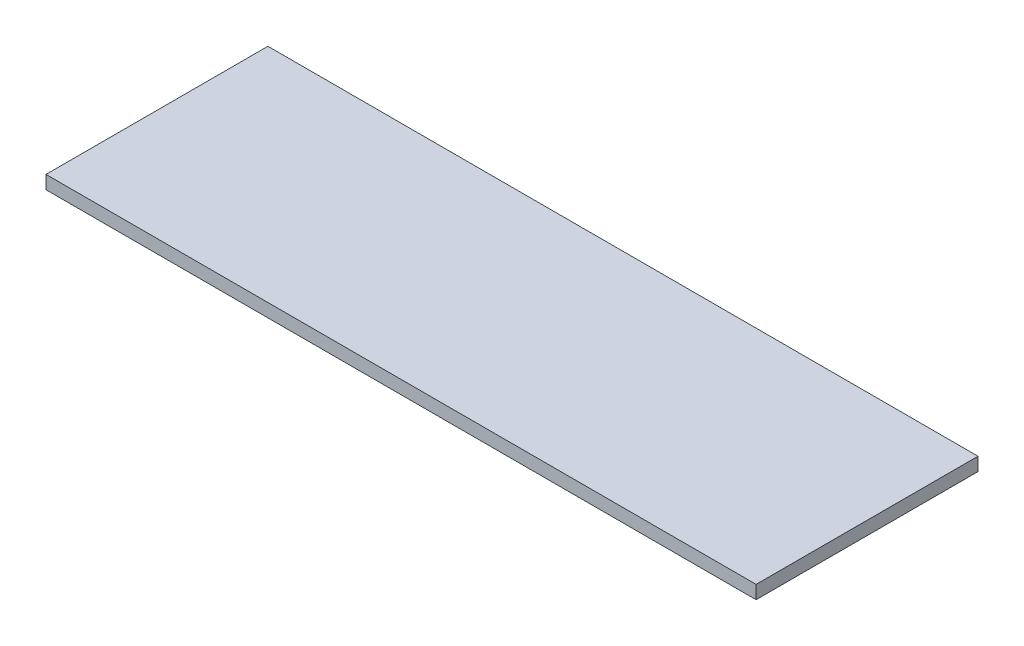
ISO-10303-21;
HEADER;
FILE_DESCRIPTION(('STEP AP214'),'2;1');
FILE_NAME('part.step','',(''),(''),'','','');
FILE_SCHEMA(('AUTOMOTIVE_DESIGN { 1 0 10303 214 1 1 1 1 }'));
ENDSEC;
DATA;
#1=APPLICATION_CONTEXT('core data for automotive mechanical design processes');
#2=APPLICATION_PROTOCOL_DEFINITION('international standard','automotive_design',2000,#1);
#3=PRODUCT_CONTEXT('',#1,'mechanical');
#4=PRODUCT('Part','Part','',(#3));
#5=PRODUCT_RELATED_PRODUCT_CATEGORY('part','',(#4));
#6=PRODUCT_DEFINITION_FORMATION('','',#4);
#7=PRODUCT_DEFINITION_CONTEXT('part definition',#1,'design');
#8=PRODUCT_DEFINITION('design','',#6,#7);
#9=PRODUCT_DEFINITION_SHAPE('','',#8);
#10=(LENGTH_UNIT() NAMED_UNIT(*) SI_UNIT(.MILLI.,.METRE.));
#11=(NAMED_UNIT(*) PLANE_ANGLE_UNIT() SI_UNIT($,.RADIAN.));
#12=(NAMED_UNIT(*) SI_UNIT($,.STERADIAN.) SOLID_ANGLE_UNIT());
#13=UNCERTAINTY_MEASURE_WITH_UNIT(LENGTH_MEASURE(1.E-05),#10,'distance_accuracy_value','');
#14=(GEOMETRIC_REPRESENTATION_CONTEXT(3) GLOBAL_UNCERTAINTY_ASSIGNED_CONTEXT((#13)) GLOBAL_UNIT_ASSIGNED_CONTEXT((#10,
#11,#12)) REPRESENTATION_CONTEXT('',''));
#15=CARTESIAN_POINT('',(0.,0.,0.));
#16=DIRECTION('',(0.,0.,1.));
#17=DIRECTION('',(1.,0.,0.));
#18=AXIS2_PLACEMENT_3D('',#15,#16,#17);
#19=CARTESIAN_POINT('',(80.,3.,25.));
#20=DIRECTION('',(-1.,0.,0.));
#21=DIRECTION('',(0.,0.,1.));
#22=AXIS2_PLACEMENT_3D('',#19,#20,#21);
#23=PLANE('',#22);
#24=DIRECTION('',(0.,0.,-1.));
#25=VECTOR('',#24,1.);
#26=CARTESIAN_POINT('',(80.,0.,25.));
#27=LINE('',#26,#25);
#28=CARTESIAN_POINT('',(80.,0.,25.));
#29=VERTEX_POINT('',#28);
#30=CARTESIAN_POINT('',(80.,0.,-25.));
#31=VERTEX_POINT('',#30);
#32=EDGE_CURVE('E104',#29,#31,#27,.T.);
#33=ORIENTED_EDGE('',*,*,#32,.T.);
#34=DIRECTION('',(0.,-1.,0.));
#35=VECTOR('',#34,1.);
#36=CARTESIAN_POINT('',(80.,3.,-25.));
#37=LINE('',#36,#35);
#38=CARTESIAN_POINT('',(80.,3.,-25.));
#39=VERTEX_POINT('',#38);
#40=EDGE_CURVE('E11',#39,#31,#37,.T.);
#41=ORIENTED_EDGE('',*,*,#40,.F.);
#42=DIRECTION('',(0.,0.,-1.));
#43=VECTOR('',#42,1.);
#44=CARTESIAN_POINT('',(80.,3.,25.));
#45=LINE('',#44,#43);
#46=CARTESIAN_POINT('',(80.,3.,25.));
#47=VERTEX_POINT('',#46);
#48=EDGE_CURVE('E92',#47,#39,#45,.T.);
#49=ORIENTED_EDGE('',*,*,#48,.F.);
#50=DIRECTION('',(0.,-1.,0.));
#51=VECTOR('',#50,1.);
#52=CARTESIAN_POINT('',(80.,3.,25.));
#53=LINE('',#52,#51);
#54=EDGE_CURVE('E100',#47,#29,#53,.T.);
#55=ORIENTED_EDGE('',*,*,#54,.T.);
#56=EDGE_LOOP('',(#33,#41,#49,#55));
#57=FACE_BOUND('',#56,.T.);
#58=ADVANCED_FACE('F41',(#57),#23,.F.);
#59=CARTESIAN_POINT('',(-80.,3.,-25.));
#60=DIRECTION('',(0.,0.,1.));
#61=DIRECTION('',(1.,0.,0.));
#62=AXIS2_PLACEMENT_3D('',#59,#60,#61);
#63=PLANE('',#62);
#64=DIRECTION('',(-1.,0.,0.));
#65=VECTOR('',#64,1.);
#66=CARTESIAN_POINT('',(-80.,0.,-25.));
#67=LINE('',#66,#65);
#68=CARTESIAN_POINT('',(-80.,0.,-25.));
#69=VERTEX_POINT('',#68);
#70=EDGE_CURVE('E96',#31,#69,#67,.T.);
#71=ORIENTED_EDGE('',*,*,#70,.T.);
#72=DIRECTION('',(0.,-1.,0.));
#73=VECTOR('',#72,1.);
#74=CARTESIAN_POINT('',(-80.,3.,-25.));
#75=LINE('',#74,#73);
#76=CARTESIAN_POINT('',(-80.,3.,-25.));
#77=VERTEX_POINT('',#76);
#78=EDGE_CURVE('E49',#77,#69,#75,.T.);
#79=ORIENTED_EDGE('',*,*,#78,.F.);
#80=DIRECTION('',(-1.,0.,0.));
#81=VECTOR('',#80,1.);
#82=CARTESIAN_POINT('',(-80.,3.,-25.));
#83=LINE('',#82,#81);
#84=EDGE_CURVE('E87',#39,#77,#83,.T.);
#85=ORIENTED_EDGE('',*,*,#84,.F.);
#86=ORIENTED_EDGE('',*,*,#40,.T.);
#87=EDGE_LOOP('',(#71,#79,#85,#86));
#88=FACE_BOUND('',#87,.T.);
#89=ADVANCED_FACE('F95',(#88),#63,.F.);
#90=CARTESIAN_POINT('',(-80.,3.,25.));
#91=DIRECTION('',(1.,0.,0.));
#92=DIRECTION('',(0.,0.,-1.));
#93=AXIS2_PLACEMENT_3D('',#90,#91,#92);
#94=PLANE('',#93);
#95=DIRECTION('',(0.,0.,1.));
#96=VECTOR('',#95,1.);
#97=CARTESIAN_POINT('',(-80.,0.,25.));
#98=LINE('',#97,#96);
#99=CARTESIAN_POINT('',(-80.,0.,25.));
#100=VERTEX_POINT('',#99);
#101=EDGE_CURVE('E74',#69,#100,#98,.T.);
#102=ORIENTED_EDGE('',*,*,#101,.T.);
#103=DIRECTION('',(0.,-1.,0.));
#104=VECTOR('',#103,1.);
#105=CARTESIAN_POINT('',(-80.,3.,25.));
#106=LINE('',#105,#104);
#107=CARTESIAN_POINT('',(-80.,3.,25.));
#108=VERTEX_POINT('',#107);
#109=EDGE_CURVE('E97',#108,#100,#106,.T.);
#110=ORIENTED_EDGE('',*,*,#109,.F.);
#111=DIRECTION('',(0.,0.,1.));
#112=VECTOR('',#111,1.);
#113=CARTESIAN_POINT('',(-80.,3.,25.));
#114=LINE('',#113,#112);
#115=EDGE_CURVE('E90',#77,#108,#114,.T.);
#116=ORIENTED_EDGE('',*,*,#115,.F.);
#117=ORIENTED_EDGE('',*,*,#78,.T.);
#118=EDGE_LOOP('',(#102,#110,#116,#117));
#119=FACE_BOUND('',#118,.T.);
#120=ADVANCED_FACE('F98',(#119),#94,.F.);
#121=CARTESIAN_POINT('',(-80.,3.,25.));
#122=DIRECTION('',(0.,0.,-1.));
#123=DIRECTION('',(-1.,0.,0.));
#124=AXIS2_PLACEMENT_3D('',#121,#122,#123);
#125=PLANE('',#124);
#126=DIRECTION('',(1.,0.,0.));
#127=VECTOR('',#126,1.);
#128=CARTESIAN_POINT('',(-80.,0.,25.));
#129=LINE('',#128,#127);
#130=EDGE_CURVE('E80',#100,#29,#129,.T.);
#131=ORIENTED_EDGE('',*,*,#130,.T.);
#132=ORIENTED_EDGE('',*,*,#54,.F.);
#133=DIRECTION('',(1.,0.,0.));
#134=VECTOR('',#133,1.);
#135=CARTESIAN_POINT('',(-80.,3.,25.));
#136=LINE('',#135,#134);
#137=EDGE_CURVE('E57',#108,#47,#136,.T.);
#138=ORIENTED_EDGE('',*,*,#137,.F.);
#139=ORIENTED_EDGE('',*,*,#109,.T.);
#140=EDGE_LOOP('',(#131,#132,#138,#139));
#141=FACE_BOUND('',#140,.T.);
#142=ADVANCED_FACE('F111',(#141),#125,.F.);
#143=CARTESIAN_POINT('',(0.,3.,0.));
#144=DIRECTION('',(0.,-1.,0.));
#145=DIRECTION('',(0.,0.,-1.));
#146=AXIS2_PLACEMENT_3D('',#143,#144,#145);
#147=PLANE('',#146);
#148=ORIENTED_EDGE('',*,*,#48,.T.);
#149=ORIENTED_EDGE('',*,*,#84,.T.);
#150=ORIENTED_EDGE('',*,*,#115,.T.);
#151=ORIENTED_EDGE('',*,*,#137,.T.);
#152=EDGE_LOOP('',(#148,#149,#150,#151));
#153=FACE_BOUND('',#152,.T.);
#154=ADVANCED_FACE('F88',(#153),#147,.F.);
#155=CARTESIAN_POINT('',(0.,0.,0.));
#156=DIRECTION('',(0.,-1.,0.));
#157=DIRECTION('',(0.,0.,-1.));
#158=AXIS2_PLACEMENT_3D('',#155,#156,#157);
#159=PLANE('',#158);
#160=ORIENTED_EDGE('',*,*,#32,.F.);
#161=ORIENTED_EDGE('',*,*,#130,.F.);
#162=ORIENTED_EDGE('',*,*,#101,.F.);
#163=ORIENTED_EDGE('',*,*,#70,.F.);
#164=EDGE_LOOP('',(#160,#161,#162,#163));
#165=FACE_BOUND('',#164,.T.);
#166=ADVANCED_FACE('F114',(#165),#159,.T.);
#167=CLOSED_SHELL('',(#58,#89,#120,#142,#154,#166));
#168=MANIFOLD_SOLID_BREP('B2',#167);
#169=ADVANCED_BREP_SHAPE_REPRESENTATION('',(#18,#168),#14);
#170=SHAPE_DEFINITION_REPRESENTATION(#9,#169);
ENDSEC;
END-ISO-10303-21;
